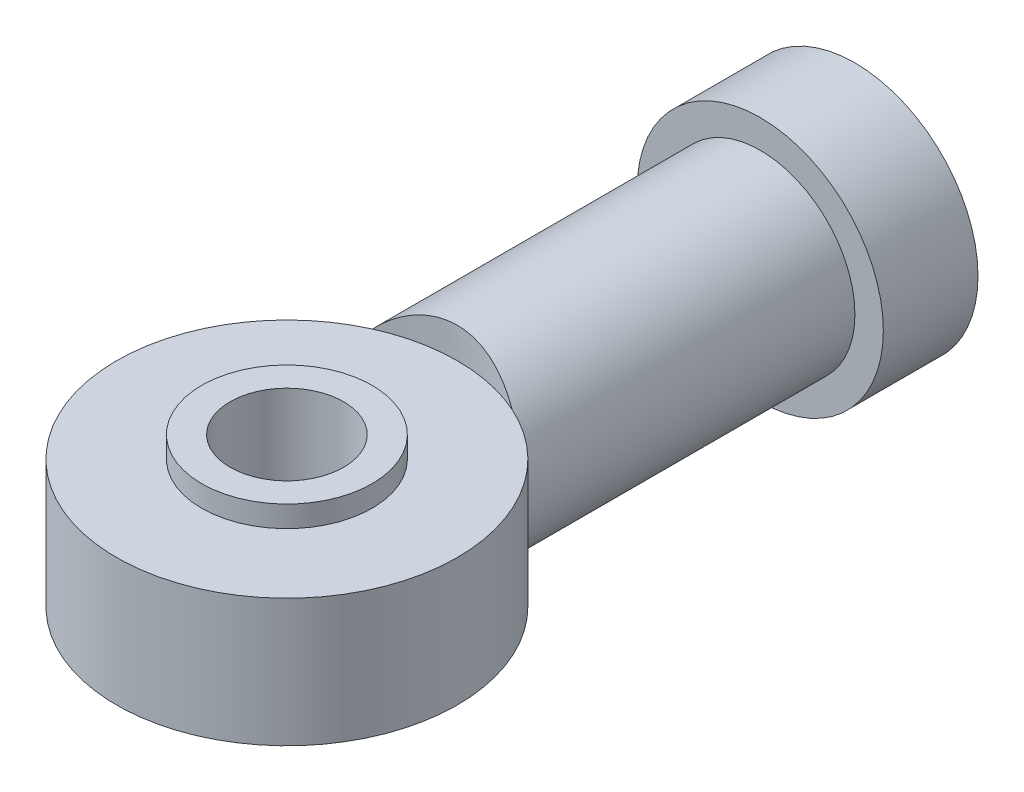
ISO-10303-21;
HEADER;
FILE_DESCRIPTION(('STEP AP214'),'2;1');
FILE_NAME('part.step','',(''),(''),'','','');
FILE_SCHEMA(('AUTOMOTIVE_DESIGN { 1 0 10303 214 1 1 1 1 }'));
ENDSEC;
DATA;
#1=APPLICATION_CONTEXT('core data for automotive mechanical design processes');
#2=APPLICATION_PROTOCOL_DEFINITION('international standard','automotive_design',2000,#1);
#3=PRODUCT_CONTEXT('',#1,'mechanical');
#4=PRODUCT('Part','Part','',(#3));
#5=PRODUCT_RELATED_PRODUCT_CATEGORY('part','',(#4));
#6=PRODUCT_DEFINITION_FORMATION('','',#4);
#7=PRODUCT_DEFINITION_CONTEXT('part definition',#1,'design');
#8=PRODUCT_DEFINITION('design','',#6,#7);
#9=PRODUCT_DEFINITION_SHAPE('','',#8);
#10=(LENGTH_UNIT() NAMED_UNIT(*) SI_UNIT(.MILLI.,.METRE.));
#11=(NAMED_UNIT(*) PLANE_ANGLE_UNIT() SI_UNIT($,.RADIAN.));
#12=(NAMED_UNIT(*) SI_UNIT($,.STERADIAN.) SOLID_ANGLE_UNIT());
#13=UNCERTAINTY_MEASURE_WITH_UNIT(LENGTH_MEASURE(1.E-05),#10,'distance_accuracy_value','');
#14=(GEOMETRIC_REPRESENTATION_CONTEXT(3) GLOBAL_UNCERTAINTY_ASSIGNED_CONTEXT((#13)) GLOBAL_UNIT_ASSIGNED_CONTEXT((#10,
#11,#12)) REPRESENTATION_CONTEXT('',''));
#15=CARTESIAN_POINT('',(0.,0.,0.));
#16=DIRECTION('',(0.,0.,1.));
#17=DIRECTION('',(1.,0.,0.));
#18=AXIS2_PLACEMENT_3D('',#15,#16,#17);
#19=CARTESIAN_POINT('',(0.,6.5,30.));
#20=DIRECTION('',(0.,-1.,0.));
#21=DIRECTION('',(0.,0.,-1.));
#22=AXIS2_PLACEMENT_3D('',#19,#20,#21);
#23=CYLINDRICAL_SURFACE('',#22,9.);
#24=CARTESIAN_POINT('',(0.,-3.375,30.));
#25=DIRECTION('',(0.,1.,0.));
#26=DIRECTION('',(0.,0.,1.));
#27=AXIS2_PLACEMENT_3D('',#24,#25,#26);
#28=CIRCLE('',#27,9.);
#29=CARTESIAN_POINT('',(-3.68908864084343,-3.375,21.7908206865729));
#30=VERTEX_POINT('',#29);
#31=CARTESIAN_POINT('',(3.68908864084343,-3.375,21.7908206865729));
#32=VERTEX_POINT('',#31);
#33=EDGE_CURVE('E93',#30,#32,#28,.T.);
#34=ORIENTED_EDGE('',*,*,#33,.T.);
#35=CARTESIAN_POINT('',(-5.,0.,22.5166852264521));
#36=CARTESIAN_POINT('',(-5.00000168612793,-0.127928170715056,22.5166875672936));
#37=CARTESIAN_POINT('',(-4.99508455829408,-0.255838132301188,22.5133942501254));
#38=CARTESIAN_POINT('',(-4.97549919253991,-0.510621042767456,22.5003634028583));
#39=CARTESIAN_POINT('',(-4.96082793002622,-0.637493657627068,22.4906238739014));
#40=CARTESIAN_POINT('',(-4.9219311144111,-0.889291751976052,22.4650724312106));
#41=CARTESIAN_POINT('',(-4.89769452651612,-1.01421480876389,22.4492535046895));
#42=CARTESIAN_POINT('',(-4.84001097740078,-1.26110748502085,22.4121504071885));
#43=CARTESIAN_POINT('',(-4.80655987877434,-1.38307575093169,22.3908637814483));
#44=CARTESIAN_POINT('',(-4.69348469782986,-1.74173874748067,22.3202142581656));
#45=CARTESIAN_POINT('',(-4.6008376898236,-1.97308729480385,22.2638507151417));
#46=CARTESIAN_POINT('',(-4.3841201609423,-2.41673416977655,22.1390171002057));
#47=CARTESIAN_POINT('',(-4.26004266043126,-2.62902825188186,22.0705443402721));
#48=CARTESIAN_POINT('',(-3.96900941703642,-3.05281452486914,21.9206156083027));
#49=CARTESIAN_POINT('',(-3.79894853966482,-3.26195895536872,21.8385491242456));
#50=CARTESIAN_POINT('',(-3.42703633826428,-3.6507208787883,21.6755434849507));
#51=CARTESIAN_POINT('',(-3.22516569308146,-3.83032028975136,21.5946050476195));
#52=CARTESIAN_POINT('',(-2.89167020747027,-4.08166010192059,21.4762754563319));
#53=CARTESIAN_POINT('',(-2.76990775893002,-4.16527912122501,21.435835052196));
#54=CARTESIAN_POINT('',(-2.51863299992486,-4.32184858251394,21.3586037344202));
#55=CARTESIAN_POINT('',(-2.38912387963632,-4.39480337411306,21.3218113348508));
#56=CARTESIAN_POINT('',(-2.12315988404788,-4.52928174685992,21.2529398794837));
#57=CARTESIAN_POINT('',(-1.98670747676404,-4.59080935417706,21.2208591644427));
#58=CARTESIAN_POINT('',(-1.70777533063704,-4.70170358844203,21.1623648311479));
#59=CARTESIAN_POINT('',(-1.56529641642995,-4.75107187294153,21.1359504405276));
#60=CARTESIAN_POINT('',(-1.2877293286113,-4.83331159601496,21.0915878070765));
#61=CARTESIAN_POINT('',(-1.15303346970813,-4.86722427041803,21.07311290074));
#62=CARTESIAN_POINT('',(-0.880630387921041,-4.9238028113414,21.0421390910695));
#63=CARTESIAN_POINT('',(-0.742923542373396,-4.94647007879502,21.029639443355));
#64=CARTESIAN_POINT('',(-0.465755150646479,-4.98021596584801,21.0109870752485));
#65=CARTESIAN_POINT('',(-0.326294736245332,-4.99130170721546,21.0048304544039));
#66=CARTESIAN_POINT('',(-0.0468047673154459,-5.00173570696184,20.9990367176424));
#67=CARTESIAN_POINT('',(0.0932247399269417,-5.00108492137827,20.999399070701));
#68=CARTESIAN_POINT('',(0.357589375165984,-4.98875939584325,21.0062410269341));
#69=CARTESIAN_POINT('',(0.481999139387698,-4.97827281423195,21.0120613007173));
#70=CARTESIAN_POINT('',(0.729391178571265,-4.94808268510851,21.0287479185357));
#71=CARTESIAN_POINT('',(0.85237300043096,-4.92837628976411,21.039615821684));
#72=CARTESIAN_POINT('',(1.0959879317887,-4.87998186460896,21.066142375768));
#73=CARTESIAN_POINT('',(1.21662181642145,-4.85129685426278,21.0817994160998));
#74=CARTESIAN_POINT('',(1.45483863725784,-4.78526368688044,21.1175461276673));
#75=CARTESIAN_POINT('',(1.57242037688768,-4.74791218757739,21.1376375088785));
#76=CARTESIAN_POINT('',(1.92181762983687,-4.62256700082792,21.2043748203024));
#77=CARTESIAN_POINT('',(2.1480017049967,-4.52174175779679,21.2572242282952));
#78=CARTESIAN_POINT('',(2.58053930802783,-4.28966562099262,21.3749635890648));
#79=CARTESIAN_POINT('',(2.78688657795254,-4.15840517004661,21.4398573226846));
#80=CARTESIAN_POINT('',(3.1981805476856,-3.8528159261413,21.584293165914));
#81=CARTESIAN_POINT('',(3.40051176015554,-3.67534870661192,21.6646610633894));
#82=CARTESIAN_POINT('',(3.77407432303871,-3.29066269952502,21.8269981737235));
#83=CARTESIAN_POINT('',(3.94527235640164,-3.08341245931567,21.9089689992951));
#84=CARTESIAN_POINT('',(4.26734084912913,-2.62215879946026,22.0737519500742));
#85=CARTESIAN_POINT('',(4.41495784404018,-2.36561956008623,22.1559656682165));
#86=CARTESIAN_POINT('',(4.60165722327992,-1.96133795588162,22.2650164810057));
#87=CARTESIAN_POINT('',(4.658109622582,-1.82330564931293,22.2989932366742));
#88=CARTESIAN_POINT('',(4.7587758249449,-1.54155222663391,22.3607894088874));
#89=CARTESIAN_POINT('',(4.80299800350574,-1.39783508109271,22.3886130365879));
#90=CARTESIAN_POINT('',(4.87549794974713,-1.11748986552017,22.4348679903404));
#91=CARTESIAN_POINT('',(4.90476696847616,-0.981212168446143,22.4538719162664));
#92=CARTESIAN_POINT('',(4.95187815824222,-0.705959092403595,22.484702292547));
#93=CARTESIAN_POINT('',(4.96972705726391,-0.566985351585589,22.4965329686938));
#94=CARTESIAN_POINT('',(4.99368227791014,-0.287692617575573,22.5124539095702));
#95=CARTESIAN_POINT('',(4.99979765850493,-0.147374746322158,22.5165501457061));
#96=CARTESIAN_POINT('',(5.00019240169459,0.133275216040527,22.516813665067));
#97=CARTESIAN_POINT('',(4.99447312326359,0.273607303667005,22.5129818586693));
#98=CARTESIAN_POINT('',(4.97305608418911,0.531875664939575,22.4987437709413));
#99=CARTESIAN_POINT('',(4.95898586540265,0.650010320230783,22.4894112541333));
#100=CARTESIAN_POINT('',(4.92258085796589,0.884473013879255,22.465501870354));
#101=CARTESIAN_POINT('',(4.90024356802702,1.00080049434618,22.4509234162067));
#102=CARTESIAN_POINT('',(4.82120532084329,1.3459518302373,22.4000010483774));
#103=CARTESIAN_POINT('',(4.75246638801692,1.57107992342602,22.3564618132241));
#104=CARTESIAN_POINT('',(4.58221724529598,2.01553201450185,22.2531616552422));
#105=CARTESIAN_POINT('',(4.47947225804339,2.2342335907062,22.192805707121));
#106=CARTESIAN_POINT('',(4.24511762030607,2.65263979276304,22.0629403742886));
#107=CARTESIAN_POINT('',(4.11349388047475,2.85233507741527,21.9934265282656));
#108=CARTESIAN_POINT('',(3.80034784976049,3.26097955461948,21.8395765344331));
#109=CARTESIAN_POINT('',(3.61419416643233,3.46617045049335,21.7546658078716));
#110=CARTESIAN_POINT('',(3.20937434365972,3.8440219318929,21.5888365813411));
#111=CARTESIAN_POINT('',(2.99068826132988,4.01666241525601,21.507920571008));
#112=CARTESIAN_POINT('',(2.63516774990158,4.25177528884975,21.393455409527));
#113=CARTESIAN_POINT('',(2.50847277030253,4.3277627198003,21.3555883990718));
#114=CARTESIAN_POINT('',(2.24791423169751,4.46864465542428,21.284204726561));
#115=CARTESIAN_POINT('',(2.11405391320455,4.53354411986924,21.2506861210385));
#116=CARTESIAN_POINT('',(1.84011344990816,4.65147414261944,21.1890017944478));
#117=CARTESIAN_POINT('',(1.70003709086338,4.70451180938823,21.160832868992));
#118=CARTESIAN_POINT('',(1.41468037296527,4.7980423274824,21.110700329695));
#119=CARTESIAN_POINT('',(1.26940080821145,4.83853708404859,21.0887357734682));
#120=CARTESIAN_POINT('',(0.990072404677547,4.90287043625824,21.0536324902938));
#121=CARTESIAN_POINT('',(0.856402908403521,4.92799270336154,21.0398189170182));
#122=CARTESIAN_POINT('',(0.586991953267882,4.96728957025403,21.0181463244869));
#123=CARTESIAN_POINT('',(0.451250723623285,4.98146537233577,21.0102866512932));
#124=CARTESIAN_POINT('',(0.178906584918183,4.99865996610084,21.000747236826));
#125=CARTESIAN_POINT('',(0.0423040816173999,5.00168366800061,20.999064775757));
#126=CARTESIAN_POINT('',(-0.23061928769788,4.99654304393119,21.0019203238885));
#127=CARTESIAN_POINT('',(-0.366940168278829,4.98837931189865,21.0064580028639));
#128=CARTESIAN_POINT('',(-0.625569673939186,4.96225300560966,21.0209216447599));
#129=CARTESIAN_POINT('',(-0.748008023900198,4.94526668852909,21.0303103585548));
#130=CARTESIAN_POINT('',(-0.990858627231259,4.90239002683889,21.0538769947974));
#131=CARTESIAN_POINT('',(-1.11127023860903,4.87649691457634,21.0680564058579));
#132=CARTESIAN_POINT('',(-1.46820122399357,4.78586534408874,21.1173280401514));
#133=CARTESIAN_POINT('',(-1.70064180021527,4.70815134393254,21.1591670780933));
#134=CARTESIAN_POINT('',(-2.15633419420624,4.51810507922043,21.2589159976607));
#135=CARTESIAN_POINT('',(-2.37903324754165,4.40471936883697,21.3173087016383));
#136=CARTESIAN_POINT('',(-2.80296262142684,4.1478778307882,21.4447413369783));
#137=CARTESIAN_POINT('',(-3.00418443375149,4.00441015235769,21.5137854616175));
#138=CARTESIAN_POINT('',(-3.40438344512707,3.67224716892185,21.6656676006612));
#139=CARTESIAN_POINT('',(-3.60037215975203,3.48023099761411,21.749175707557));
#140=CARTESIAN_POINT('',(-3.86903363258921,3.17007268449902,21.8734756439129));
#141=CARTESIAN_POINT('',(-3.95443792366344,3.06288246096794,21.9147883138079));
#142=CARTESIAN_POINT('',(-4.11642028323729,2.84145897559001,21.9960461453973));
#143=CARTESIAN_POINT('',(-4.19299678916886,2.7272244723415,22.0359910641151));
#144=CARTESIAN_POINT('',(-4.34192328581963,2.48384412153507,22.1161329238467));
#145=CARTESIAN_POINT('',(-4.41358524085905,2.35421559392717,22.1561457028123));
#146=CARTESIAN_POINT('',(-4.5455123626852,2.08814528076008,22.2318534602701));
#147=CARTESIAN_POINT('',(-4.60578326299018,1.95170696675683,22.2675506076935));
#148=CARTESIAN_POINT('',(-4.7141322351862,1.67309306323949,22.3331255402937));
#149=CARTESIAN_POINT('',(-4.7622390452046,1.53093193379134,22.3630170021018));
#150=CARTESIAN_POINT('',(-4.84569782953676,1.24171103409555,22.4156969476415));
#151=CARTESIAN_POINT('',(-4.88105782195096,1.0946544070744,22.4384898953025));
#152=CARTESIAN_POINT('',(-4.93958350003765,0.790827416689644,22.4765836277343));
#153=CARTESIAN_POINT('',(-4.96219291852393,0.633905510712647,22.4915408659841));
#154=CARTESIAN_POINT('',(-4.99239972476833,0.317979622880839,22.5115899505863));
#155=CARTESIAN_POINT('',(-4.99999790465655,0.158975751335294,22.5166823174992));
#156=CARTESIAN_POINT('',(-5.,0.,22.5166852264521));
#157=B_SPLINE_CURVE_WITH_KNOTS('',3,(#35,#36,#37,#38,#39,#40,#41,#42,#43,#44,#45,#46,#47,#48,
#49,#50,#51,#52,#53,#54,#55,#56,#57,#58,#59,#60,#61,#62,#63,#64,#65,#66,#67,#68,#69,#70,#71,#72,
#73,#74,#75,#76,#77,#78,#79,#80,#81,#82,#83,#84,#85,#86,#87,#88,#89,#90,#91,#92,#93,#94,#95,#96,
#97,#98,#99,#100,#101,#102,#103,#104,#105,#106,#107,#108,#109,#110,#111,#112,#113,#114,#115,
#116,#117,#118,#119,#120,#121,#122,#123,#124,#125,#126,#127,#128,#129,#130,#131,#132,#133,#134,
#135,#136,#137,#138,#139,#140,#141,#142,#143,#144,#145,#146,#147,#148,#149,#150,#151,#152,#153,
#154,#155,#156),.UNSPECIFIED.,.T.,.F.,(4,2,2,2,2,2,2,2,2,2,2,2,2,2,2,2,2,2,2,2,2,2,2,2,2,2,2,2,
2,2,2,2,2,2,2,2,2,2,2,2,2,2,2,2,2,2,2,2,2,2,2,2,2,2,2,2,2,2,2,2,4),(0.,0.383617262434558,
0.767353533654935,1.15153379253867,1.53588683411637,2.29887381256895,3.06203037306044,
3.90401345702823,4.74650994436255,5.20543330239271,5.66416895408678,6.12274267036475,
6.58125383950371,7.00103463233332,7.42076311645811,7.84023334691958,8.25966940820447,
8.63418281341922,9.00881197544207,9.38331528661349,9.75796326728325,10.5142082489873,
11.2706910268593,12.1098131090736,12.9498279570035,13.8660549484084,14.3243316832876,
14.782293799555,15.2036849882509,15.6248276917814,16.0456451171919,16.4664142228104,
16.8239929217894,17.1816798984961,17.8966505229979,18.6411117273933,19.3859369498883,
20.2516469645331,21.1178898770868,21.5748932590507,22.0316916800075,22.4882156157593,
22.9446701724715,23.3542362432264,23.7637573233568,24.1730980717718,24.5824170892821,
24.9538736149232,25.3254456695292,26.0679180989854,26.834783232574,27.6019510415397,
28.4584307032008,28.8875063562192,29.3166578418249,29.7763339243287,30.2357780158996,
30.6941262921722,31.1521857495434,31.6289303211718,32.105649734729),.UNSPECIFIED.);
#158=CARTESIAN_POINT('',(3.68908864084343,3.375,21.7908206865729));
#159=VERTEX_POINT('',#158);
#160=EDGE_CURVE('E63',#32,#159,#157,.T.);
#161=ORIENTED_EDGE('',*,*,#160,.T.);
#162=CARTESIAN_POINT('',(0.,3.375,30.));
#163=DIRECTION('',(0.,1.,0.));
#164=DIRECTION('',(0.,0.,1.));
#165=AXIS2_PLACEMENT_3D('',#162,#163,#164);
#166=CIRCLE('',#165,9.);
#167=CARTESIAN_POINT('',(-3.68908864084343,3.375,21.7908206865729));
#168=VERTEX_POINT('',#167);
#169=EDGE_CURVE('E102',#168,#159,#166,.T.);
#170=ORIENTED_EDGE('',*,*,#169,.F.);
#171=EDGE_CURVE('E116',#168,#30,#157,.T.);
#172=ORIENTED_EDGE('',*,*,#171,.T.);
#173=EDGE_LOOP('',(#34,#161,#170,#172));
#174=FACE_BOUND('',#173,.T.);
#175=ADVANCED_FACE('F39',(#174),#23,.T.);
#176=CARTESIAN_POINT('',(0.,-4.5,30.));
#177=DIRECTION('',(0.,-1.,0.));
#178=DIRECTION('',(0.,0.,1.));
#179=AXIS2_PLACEMENT_3D('',#176,#177,#178);
#180=PLANE('',#179);
#181=CARTESIAN_POINT('',(0.,-4.5,30.));
#182=DIRECTION('',(0.,-1.,0.));
#183=DIRECTION('',(0.,0.,-1.));
#184=AXIS2_PLACEMENT_3D('',#181,#182,#183);
#185=CIRCLE('',#184,3.);
#186=CARTESIAN_POINT('',(0.,-4.5,27.));
#187=VERTEX_POINT('',#186);
#188=EDGE_CURVE('E107',#187,#187,#185,.F.);
#189=ORIENTED_EDGE('',*,*,#188,.T.);
#190=EDGE_LOOP('',(#189));
#191=FACE_BOUND('',#190,.T.);
#192=CARTESIAN_POINT('',(0.,-4.5,30.));
#193=DIRECTION('',(0.,1.,0.));
#194=DIRECTION('',(0.,0.,1.));
#195=AXIS2_PLACEMENT_3D('',#192,#193,#194);
#196=CIRCLE('',#195,4.5);
#197=CARTESIAN_POINT('',(0.,-4.5,34.5));
#198=VERTEX_POINT('',#197);
#199=EDGE_CURVE('E83',#198,#198,#196,.T.);
#200=ORIENTED_EDGE('',*,*,#199,.F.);
#201=EDGE_LOOP('',(#200));
#202=FACE_BOUND('',#201,.T.);
#203=ADVANCED_FACE('F125',(#191,#202),#180,.T.);
#204=CARTESIAN_POINT('',(0.,4.5,30.));
#205=DIRECTION('',(0.,1.,0.));
#206=DIRECTION('',(0.,0.,1.));
#207=AXIS2_PLACEMENT_3D('',#204,#205,#206);
#208=PLANE('',#207);
#209=CARTESIAN_POINT('',(0.,4.5,30.));
#210=DIRECTION('',(0.,1.,0.));
#211=DIRECTION('',(0.,0.,1.));
#212=AXIS2_PLACEMENT_3D('',#209,#210,#211);
#213=CIRCLE('',#212,3.);
#214=CARTESIAN_POINT('',(0.,4.5,33.));
#215=VERTEX_POINT('',#214);
#216=EDGE_CURVE('E43',#215,#215,#213,.F.);
#217=ORIENTED_EDGE('',*,*,#216,.T.);
#218=EDGE_LOOP('',(#217));
#219=FACE_BOUND('',#218,.T.);
#220=CARTESIAN_POINT('',(0.,4.5,30.));
#221=DIRECTION('',(0.,1.,0.));
#222=DIRECTION('',(0.,0.,1.));
#223=AXIS2_PLACEMENT_3D('',#220,#221,#222);
#224=CIRCLE('',#223,4.5);
#225=CARTESIAN_POINT('',(0.,4.5,34.5));
#226=VERTEX_POINT('',#225);
#227=EDGE_CURVE('E98',#226,#226,#224,.T.);
#228=ORIENTED_EDGE('',*,*,#227,.T.);
#229=EDGE_LOOP('',(#228));
#230=FACE_BOUND('',#229,.T.);
#231=ADVANCED_FACE('F129',(#219,#230),#208,.T.);
#232=CARTESIAN_POINT('',(0.,-11.5,30.));
#233=DIRECTION('',(0.,1.,0.));
#234=DIRECTION('',(0.,0.,1.));
#235=AXIS2_PLACEMENT_3D('',#232,#233,#234);
#236=CYLINDRICAL_SURFACE('',#235,3.);
#237=ORIENTED_EDGE('',*,*,#216,.F.);
#238=EDGE_LOOP('',(#237));
#239=FACE_BOUND('',#238,.T.);
#240=ORIENTED_EDGE('',*,*,#188,.F.);
#241=EDGE_LOOP('',(#240));
#242=FACE_BOUND('',#241,.T.);
#243=ADVANCED_FACE('F126',(#239,#242),#236,.F.);
#244=CARTESIAN_POINT('',(0.,0.,5.));
#245=DIRECTION('',(0.,0.,-1.));
#246=DIRECTION('',(-1.,0.,0.));
#247=AXIS2_PLACEMENT_3D('',#244,#245,#246);
#248=CYLINDRICAL_SURFACE('',#247,6.5);
#249=CARTESIAN_POINT('',(0.,0.,5.));
#250=DIRECTION('',(0.,0.,1.));
#251=DIRECTION('',(1.,0.,0.));
#252=AXIS2_PLACEMENT_3D('',#249,#250,#251);
#253=CIRCLE('',#252,6.5);
#254=CARTESIAN_POINT('',(6.5,0.,5.));
#255=VERTEX_POINT('',#254);
#256=EDGE_CURVE('E48',#255,#255,#253,.T.);
#257=ORIENTED_EDGE('',*,*,#256,.F.);
#258=EDGE_LOOP('',(#257));
#259=FACE_BOUND('',#258,.T.);
#260=CARTESIAN_POINT('',(0.,0.,0.));
#261=DIRECTION('',(0.,0.,1.));
#262=DIRECTION('',(1.,0.,0.));
#263=AXIS2_PLACEMENT_3D('',#260,#261,#262);
#264=CIRCLE('',#263,6.5);
#265=CARTESIAN_POINT('',(6.5,0.,0.));
#266=VERTEX_POINT('',#265);
#267=EDGE_CURVE('E115',#266,#266,#264,.T.);
#268=ORIENTED_EDGE('',*,*,#267,.T.);
#269=EDGE_LOOP('',(#268));
#270=FACE_BOUND('',#269,.T.);
#271=ADVANCED_FACE('F41',(#259,#270),#248,.T.);
#272=CARTESIAN_POINT('',(0.,0.,5.));
#273=DIRECTION('',(0.,0.,1.));
#274=DIRECTION('',(1.,0.,0.));
#275=AXIS2_PLACEMENT_3D('',#272,#273,#274);
#276=PLANE('',#275);
#277=CARTESIAN_POINT('',(0.,0.,5.));
#278=DIRECTION('',(0.,0.,1.));
#279=DIRECTION('',(1.,0.,0.));
#280=AXIS2_PLACEMENT_3D('',#277,#278,#279);
#281=CIRCLE('',#280,5.);
#282=CARTESIAN_POINT('',(5.,0.,5.));
#283=VERTEX_POINT('',#282);
#284=EDGE_CURVE('E11',#283,#283,#281,.T.);
#285=ORIENTED_EDGE('',*,*,#284,.F.);
#286=EDGE_LOOP('',(#285));
#287=FACE_BOUND('',#286,.T.);
#288=ORIENTED_EDGE('',*,*,#256,.T.);
#289=EDGE_LOOP('',(#288));
#290=FACE_BOUND('',#289,.T.);
#291=ADVANCED_FACE('F168',(#287,#290),#276,.T.);
#292=CARTESIAN_POINT('',(0.,0.,0.));
#293=DIRECTION('',(0.,0.,1.));
#294=DIRECTION('',(1.,0.,0.));
#295=AXIS2_PLACEMENT_3D('',#292,#293,#294);
#296=PLANE('',#295);
#297=CARTESIAN_POINT('',(0.,0.,0.));
#298=DIRECTION('',(0.,0.,-1.));
#299=DIRECTION('',(-1.,0.,0.));
#300=AXIS2_PLACEMENT_3D('',#297,#298,#299);
#301=CIRCLE('',#300,2.49999999999999);
#302=CARTESIAN_POINT('',(-2.49999999999999,0.,0.));
#303=VERTEX_POINT('',#302);
#304=EDGE_CURVE('E84',#303,#303,#301,.T.);
#305=ORIENTED_EDGE('',*,*,#304,.F.);
#306=EDGE_LOOP('',(#305));
#307=FACE_BOUND('',#306,.T.);
#308=ORIENTED_EDGE('',*,*,#267,.F.);
#309=EDGE_LOOP('',(#308));
#310=FACE_BOUND('',#309,.T.);
#311=ADVANCED_FACE('F165',(#307,#310),#296,.F.);
#312=CARTESIAN_POINT('',(0.,0.,39.001));
#313=DIRECTION('',(0.,0.,-1.));
#314=DIRECTION('',(-1.,0.,0.));
#315=AXIS2_PLACEMENT_3D('',#312,#313,#314);
#316=CYLINDRICAL_SURFACE('',#315,5.);
#317=ORIENTED_EDGE('',*,*,#284,.T.);
#318=EDGE_LOOP('',(#317));
#319=FACE_BOUND('',#318,.T.);
#320=EDGE_CURVE('E55',#159,#168,#157,.T.);
#321=ORIENTED_EDGE('',*,*,#320,.F.);
#322=ORIENTED_EDGE('',*,*,#160,.F.);
#323=EDGE_CURVE('E117',#30,#32,#157,.T.);
#324=ORIENTED_EDGE('',*,*,#323,.F.);
#325=ORIENTED_EDGE('',*,*,#171,.F.);
#326=EDGE_LOOP('',(#321,#322,#324,#325));
#327=FACE_BOUND('',#326,.T.);
#328=ADVANCED_FACE('F118',(#319,#327),#316,.T.);
#329=CARTESIAN_POINT('',(0.,4.5,30.));
#330=DIRECTION('',(0.,1.,0.));
#331=DIRECTION('',(0.,0.,1.));
#332=AXIS2_PLACEMENT_3D('',#329,#330,#331);
#333=CYLINDRICAL_SURFACE('',#332,9.);
#334=ORIENTED_EDGE('',*,*,#320,.T.);
#335=EDGE_CURVE('E105',#159,#168,#166,.T.);
#336=ORIENTED_EDGE('',*,*,#335,.F.);
#337=EDGE_LOOP('',(#334,#336));
#338=FACE_BOUND('',#337,.T.);
#339=ADVANCED_FACE('F131',(#338),#333,.F.);
#340=CARTESIAN_POINT('',(0.,-4.5,30.));
#341=DIRECTION('',(0.,-1.,0.));
#342=DIRECTION('',(0.,0.,-1.));
#343=AXIS2_PLACEMENT_3D('',#340,#341,#342);
#344=CYLINDRICAL_SURFACE('',#343,9.);
#345=EDGE_CURVE('E95',#32,#30,#28,.T.);
#346=ORIENTED_EDGE('',*,*,#345,.T.);
#347=ORIENTED_EDGE('',*,*,#323,.T.);
#348=EDGE_LOOP('',(#346,#347));
#349=FACE_BOUND('',#348,.T.);
#350=ADVANCED_FACE('F134',(#349),#344,.F.);
#351=CARTESIAN_POINT('',(0.,3.375,30.));
#352=DIRECTION('',(0.,1.,0.));
#353=DIRECTION('',(0.,0.,1.));
#354=AXIS2_PLACEMENT_3D('',#351,#352,#353);
#355=PLANE('',#354);
#356=CARTESIAN_POINT('',(0.,3.375,30.));
#357=DIRECTION('',(0.,1.,0.));
#358=DIRECTION('',(0.,0.,1.));
#359=AXIS2_PLACEMENT_3D('',#356,#357,#358);
#360=CIRCLE('',#359,4.5);
#361=CARTESIAN_POINT('',(0.,3.375,34.5));
#362=VERTEX_POINT('',#361);
#363=EDGE_CURVE('E99',#362,#362,#360,.T.);
#364=ORIENTED_EDGE('',*,*,#363,.F.);
#365=EDGE_LOOP('',(#364));
#366=FACE_BOUND('',#365,.T.);
#367=ORIENTED_EDGE('',*,*,#335,.T.);
#368=ORIENTED_EDGE('',*,*,#169,.T.);
#369=EDGE_LOOP('',(#367,#368));
#370=FACE_BOUND('',#369,.T.);
#371=ADVANCED_FACE('F140',(#366,#370),#355,.T.);
#372=CARTESIAN_POINT('',(0.,3.375,30.));
#373=DIRECTION('',(0.,1.,0.));
#374=DIRECTION('',(0.,0.,1.));
#375=AXIS2_PLACEMENT_3D('',#372,#373,#374);
#376=CYLINDRICAL_SURFACE('',#375,4.5);
#377=ORIENTED_EDGE('',*,*,#363,.T.);
#378=EDGE_LOOP('',(#377));
#379=FACE_BOUND('',#378,.T.);
#380=ORIENTED_EDGE('',*,*,#227,.F.);
#381=EDGE_LOOP('',(#380));
#382=FACE_BOUND('',#381,.T.);
#383=ADVANCED_FACE('F147',(#379,#382),#376,.T.);
#384=CARTESIAN_POINT('',(0.,-3.375,30.));
#385=DIRECTION('',(0.,-1.,0.));
#386=DIRECTION('',(0.,0.,1.));
#387=AXIS2_PLACEMENT_3D('',#384,#385,#386);
#388=PLANE('',#387);
#389=ORIENTED_EDGE('',*,*,#345,.F.);
#390=ORIENTED_EDGE('',*,*,#33,.F.);
#391=EDGE_LOOP('',(#389,#390));
#392=FACE_BOUND('',#391,.T.);
#393=CARTESIAN_POINT('',(0.,-3.375,30.));
#394=DIRECTION('',(0.,1.,0.));
#395=DIRECTION('',(0.,0.,1.));
#396=AXIS2_PLACEMENT_3D('',#393,#394,#395);
#397=CIRCLE('',#396,4.5);
#398=CARTESIAN_POINT('',(0.,-3.375,34.5));
#399=VERTEX_POINT('',#398);
#400=EDGE_CURVE('E87',#399,#399,#397,.T.);
#401=ORIENTED_EDGE('',*,*,#400,.T.);
#402=EDGE_LOOP('',(#401));
#403=FACE_BOUND('',#402,.T.);
#404=ADVANCED_FACE('F151',(#392,#403),#388,.T.);
#405=CARTESIAN_POINT('',(0.,-3.375,30.));
#406=DIRECTION('',(0.,-1.,0.));
#407=DIRECTION('',(0.,0.,-1.));
#408=AXIS2_PLACEMENT_3D('',#405,#406,#407);
#409=CYLINDRICAL_SURFACE('',#408,4.5);
#410=ORIENTED_EDGE('',*,*,#400,.F.);
#411=EDGE_LOOP('',(#410));
#412=FACE_BOUND('',#411,.T.);
#413=ORIENTED_EDGE('',*,*,#199,.T.);
#414=EDGE_LOOP('',(#413));
#415=FACE_BOUND('',#414,.T.);
#416=ADVANCED_FACE('F77',(#412,#415),#409,.T.);
#417=CARTESIAN_POINT('',(0.,0.,17.));
#418=DIRECTION('',(0.,0.,-1.));
#419=DIRECTION('',(-1.,0.,0.));
#420=AXIS2_PLACEMENT_3D('',#417,#418,#419);
#421=CONICAL_SURFACE('',#420,2.5,1.02974425867665);
#422=CARTESIAN_POINT('',(0.,0.,18.5021515475689));
#423=VERTEX_POINT('',#422);
#424=VERTEX_LOOP('',#423);
#425=FACE_BOUND('',#424,.T.);
#426=CARTESIAN_POINT('',(0.,0.,17.));
#427=DIRECTION('',(0.,0.,-1.));
#428=DIRECTION('',(-1.,0.,0.));
#429=AXIS2_PLACEMENT_3D('',#426,#427,#428);
#430=CIRCLE('',#429,2.5);
#431=CARTESIAN_POINT('',(-2.5,0.,17.));
#432=VERTEX_POINT('',#431);
#433=EDGE_CURVE('E81',#432,#432,#430,.T.);
#434=ORIENTED_EDGE('',*,*,#433,.T.);
#435=EDGE_LOOP('',(#434));
#436=FACE_BOUND('',#435,.T.);
#437=ADVANCED_FACE('F73',(#425,#436),#421,.F.);
#438=CARTESIAN_POINT('',(0.,0.,0.));
#439=DIRECTION('',(0.,0.,-1.));
#440=DIRECTION('',(-1.,0.,0.));
#441=AXIS2_PLACEMENT_3D('',#438,#439,#440);
#442=CYLINDRICAL_SURFACE('',#441,2.49999999999999);
#443=ORIENTED_EDGE('',*,*,#433,.F.);
#444=EDGE_LOOP('',(#443));
#445=FACE_BOUND('',#444,.T.);
#446=ORIENTED_EDGE('',*,*,#304,.T.);
#447=EDGE_LOOP('',(#446));
#448=FACE_BOUND('',#447,.T.);
#449=ADVANCED_FACE('F76',(#445,#448),#442,.F.);
#450=CLOSED_SHELL('',(#175,#203,#231,#243,#271,#291,#311,#328,#339,#350,#371,#383,#404,#416,
#437,#449));
#451=MANIFOLD_SOLID_BREP('B2',#450);
#452=ADVANCED_BREP_SHAPE_REPRESENTATION('',(#18,#451),#14);
#453=SHAPE_DEFINITION_REPRESENTATION(#9,#452);
ENDSEC;
END-ISO-10303-21;
